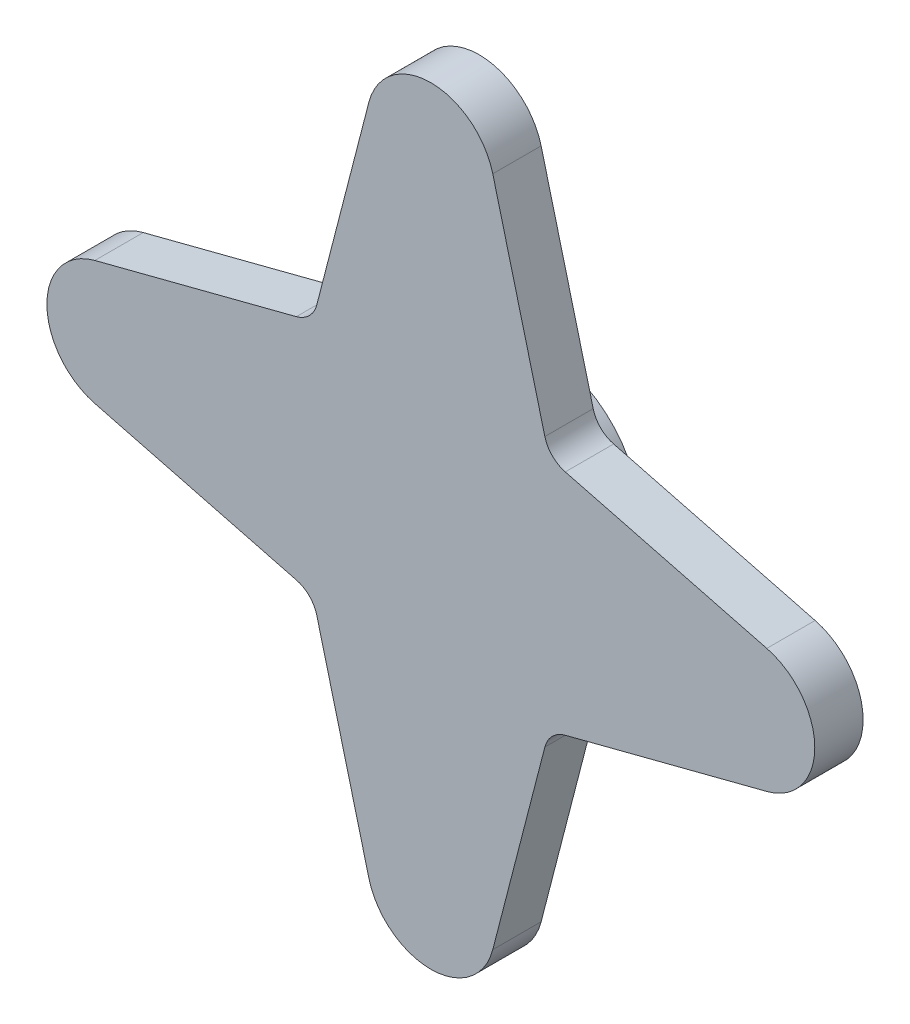
ISO-10303-21;
HEADER;
FILE_DESCRIPTION(('STEP AP214'),'2;1');
FILE_NAME('part.step','',(''),(''),'','','');
FILE_SCHEMA(('AUTOMOTIVE_DESIGN { 1 0 10303 214 1 1 1 1 }'));
ENDSEC;
DATA;
#1=APPLICATION_CONTEXT('core data for automotive mechanical design processes');
#2=APPLICATION_PROTOCOL_DEFINITION('international standard','automotive_design',2000,#1);
#3=PRODUCT_CONTEXT('',#1,'mechanical');
#4=PRODUCT('Part','Part','',(#3));
#5=PRODUCT_RELATED_PRODUCT_CATEGORY('part','',(#4));
#6=PRODUCT_DEFINITION_FORMATION('','',#4);
#7=PRODUCT_DEFINITION_CONTEXT('part definition',#1,'design');
#8=PRODUCT_DEFINITION('design','',#6,#7);
#9=PRODUCT_DEFINITION_SHAPE('','',#8);
#10=(LENGTH_UNIT() NAMED_UNIT(*) SI_UNIT(.MILLI.,.METRE.));
#11=(NAMED_UNIT(*) PLANE_ANGLE_UNIT() SI_UNIT($,.RADIAN.));
#12=(NAMED_UNIT(*) SI_UNIT($,.STERADIAN.) SOLID_ANGLE_UNIT());
#13=UNCERTAINTY_MEASURE_WITH_UNIT(LENGTH_MEASURE(1.E-05),#10,'distance_accuracy_value','');
#14=(GEOMETRIC_REPRESENTATION_CONTEXT(3) GLOBAL_UNCERTAINTY_ASSIGNED_CONTEXT((#13)) GLOBAL_UNIT_ASSIGNED_CONTEXT((#10,
#11,#12)) REPRESENTATION_CONTEXT('',''));
#15=CARTESIAN_POINT('',(0.,0.,0.));
#16=DIRECTION('',(0.,0.,1.));
#17=DIRECTION('',(1.,0.,0.));
#18=AXIS2_PLACEMENT_3D('',#15,#16,#17);
#19=CARTESIAN_POINT('',(-5.15,0.,-2.2));
#20=DIRECTION('',(0.,0.,1.));
#21=DIRECTION('',(1.,0.,0.));
#22=AXIS2_PLACEMENT_3D('',#19,#20,#21);
#23=CYLINDRICAL_SURFACE('',#22,3.45);
#24=CARTESIAN_POINT('',(-5.15,0.,-2.2));
#25=DIRECTION('',(0.,0.,1.));
#26=DIRECTION('',(1.,0.,0.));
#27=AXIS2_PLACEMENT_3D('',#24,#25,#26);
#28=CIRCLE('',#27,3.45);
#29=CARTESIAN_POINT('',(-1.7,0.,-2.2));
#30=VERTEX_POINT('',#29);
#31=EDGE_CURVE('E246',#30,#30,#28,.T.);
#32=ORIENTED_EDGE('',*,*,#31,.T.);
#33=EDGE_LOOP('',(#32));
#34=FACE_BOUND('',#33,.T.);
#35=CARTESIAN_POINT('',(-5.15,0.,0.));
#36=DIRECTION('',(0.,0.,1.));
#37=DIRECTION('',(1.,0.,0.));
#38=AXIS2_PLACEMENT_3D('',#35,#36,#37);
#39=CIRCLE('',#38,3.45);
#40=CARTESIAN_POINT('',(-1.7,0.,0.));
#41=VERTEX_POINT('',#40);
#42=EDGE_CURVE('E224',#41,#41,#39,.T.);
#43=ORIENTED_EDGE('',*,*,#42,.F.);
#44=EDGE_LOOP('',(#43));
#45=FACE_BOUND('',#44,.T.);
#46=ADVANCED_FACE('F37',(#34,#45),#23,.T.);
#47=CARTESIAN_POINT('',(-5.15,0.,-2.2));
#48=DIRECTION('',(0.,0.,1.));
#49=DIRECTION('',(1.,0.,0.));
#50=AXIS2_PLACEMENT_3D('',#47,#48,#49);
#51=CYLINDRICAL_SURFACE('',#50,2.5);
#52=CARTESIAN_POINT('',(-5.15,0.,-0.2));
#53=DIRECTION('',(0.,0.,-1.));
#54=DIRECTION('',(-1.,0.,0.));
#55=AXIS2_PLACEMENT_3D('',#52,#53,#54);
#56=CIRCLE('',#55,2.5);
#57=CARTESIAN_POINT('',(-7.65,0.,-0.2));
#58=VERTEX_POINT('',#57);
#59=EDGE_CURVE('E296',#58,#58,#56,.T.);
#60=ORIENTED_EDGE('',*,*,#59,.F.);
#61=EDGE_LOOP('',(#60));
#62=FACE_BOUND('',#61,.T.);
#63=CARTESIAN_POINT('',(-5.15,0.,-2.2));
#64=DIRECTION('',(0.,0.,1.));
#65=DIRECTION('',(1.,0.,0.));
#66=AXIS2_PLACEMENT_3D('',#63,#64,#65);
#67=CIRCLE('',#66,2.5);
#68=CARTESIAN_POINT('',(-2.65,0.,-2.2));
#69=VERTEX_POINT('',#68);
#70=EDGE_CURVE('E243',#69,#69,#67,.T.);
#71=ORIENTED_EDGE('',*,*,#70,.F.);
#72=EDGE_LOOP('',(#71));
#73=FACE_BOUND('',#72,.T.);
#74=ADVANCED_FACE('F303',(#62,#73),#51,.F.);
#75=CARTESIAN_POINT('',(0.,0.,-2.2));
#76=DIRECTION('',(0.,0.,1.));
#77=DIRECTION('',(1.,0.,0.));
#78=AXIS2_PLACEMENT_3D('',#75,#76,#77);
#79=PLANE('',#78);
#80=ORIENTED_EDGE('',*,*,#70,.T.);
#81=EDGE_LOOP('',(#80));
#82=FACE_BOUND('',#81,.T.);
#83=ORIENTED_EDGE('',*,*,#31,.F.);
#84=EDGE_LOOP('',(#83));
#85=FACE_BOUND('',#84,.T.);
#86=ADVANCED_FACE('F306',(#82,#85),#79,.F.);
#87=CARTESIAN_POINT('',(0.,0.,1.7));
#88=DIRECTION('',(0.,0.,1.));
#89=DIRECTION('',(1.,0.,0.));
#90=AXIS2_PLACEMENT_3D('',#87,#88,#89);
#91=PLANE('',#90);
#92=DIRECTION('',(-0.250229959450548,-0.968186432146917,0.));
#93=VECTOR('',#92,1.);
#94=CARTESIAN_POINT('',(1.00163519950034,3.56009605648765,1.7));
#95=LINE('',#94,#93);
#96=CARTESIAN_POINT('',(-1.14034217000043,-4.72761430269594,1.7));
#97=VERTEX_POINT('',#96);
#98=CARTESIAN_POINT('',(-2.97158052766944,-11.8130174087637,1.7));
#99=VERTEX_POINT('',#98);
#100=EDGE_CURVE('E201',#97,#99,#95,.T.);
#101=ORIENTED_EDGE('',*,*,#100,.F.);
#102=CARTESIAN_POINT('',(-0.172155737853513,-4.97784426214649,1.7));
#103=DIRECTION('',(0.,0.,1.));
#104=DIRECTION('',(1.,0.,0.));
#105=AXIS2_PLACEMENT_3D('',#102,#103,#104);
#106=CIRCLE('',#105,1.);
#107=CARTESIAN_POINT('',(-0.422385697304059,-4.00965782999957,1.7));
#108=VERTEX_POINT('',#107);
#109=EDGE_CURVE('E156',#97,#108,#106,.F.);
#110=ORIENTED_EDGE('',*,*,#109,.T.);
#111=DIRECTION('',(0.968186432146917,0.250229959450548,0.));
#112=VECTOR('',#111,1.);
#113=CARTESIAN_POINT('',(-8.71009605648765,-6.15163519950034,1.7));
#114=LINE('',#113,#112);
#115=CARTESIAN_POINT('',(6.66301740876374,-2.17841947233057,1.7));
#116=VERTEX_POINT('',#115);
#117=EDGE_CURVE('E148',#108,#116,#114,.T.);
#118=ORIENTED_EDGE('',*,*,#117,.T.);
#119=CARTESIAN_POINT('',(6.1,0.,1.7));
#120=DIRECTION('',(0.,0.,1.));
#121=DIRECTION('',(-1.,0.,0.));
#122=AXIS2_PLACEMENT_3D('',#119,#120,#121);
#123=CIRCLE('',#122,2.25);
#124=CARTESIAN_POINT('',(6.66301740876374,2.17841947233056,1.7));
#125=VERTEX_POINT('',#124);
#126=EDGE_CURVE('E153',#116,#125,#123,.T.);
#127=ORIENTED_EDGE('',*,*,#126,.T.);
#128=DIRECTION('',(0.968186432146917,-0.250229959450549,0.));
#129=VECTOR('',#128,1.);
#130=CARTESIAN_POINT('',(-8.71009605648765,6.15163519950035,1.7));
#131=LINE('',#130,#129);
#132=CARTESIAN_POINT('',(-0.422385697304057,4.00965782999957,1.7));
#133=VERTEX_POINT('',#132);
#134=EDGE_CURVE('E170',#133,#125,#131,.T.);
#135=ORIENTED_EDGE('',*,*,#134,.F.);
#136=CARTESIAN_POINT('',(-0.172155737853512,4.97784426214648,1.7));
#137=DIRECTION('',(0.,0.,1.));
#138=DIRECTION('',(1.,0.,0.));
#139=AXIS2_PLACEMENT_3D('',#136,#137,#138);
#140=CIRCLE('',#139,1.);
#141=CARTESIAN_POINT('',(-1.14034217000043,4.72761430269593,1.7));
#142=VERTEX_POINT('',#141);
#143=EDGE_CURVE('E276',#133,#142,#140,.F.);
#144=ORIENTED_EDGE('',*,*,#143,.T.);
#145=DIRECTION('',(-0.250229959450548,0.968186432146917,0.));
#146=VECTOR('',#145,1.);
#147=CARTESIAN_POINT('',(1.00163519950035,-3.56009605648765,1.7));
#148=LINE('',#147,#146);
#149=CARTESIAN_POINT('',(-2.97158052766943,11.8130174087637,1.7));
#150=VERTEX_POINT('',#149);
#151=EDGE_CURVE('E185',#142,#150,#148,.T.);
#152=ORIENTED_EDGE('',*,*,#151,.T.);
#153=CARTESIAN_POINT('',(-5.15,11.25,1.7));
#154=DIRECTION('',(0.,0.,-1.));
#155=DIRECTION('',(0.,-1.,0.));
#156=AXIS2_PLACEMENT_3D('',#153,#154,#155);
#157=CIRCLE('',#156,2.25);
#158=CARTESIAN_POINT('',(-7.32841947233056,11.8130174087637,1.7));
#159=VERTEX_POINT('',#158);
#160=EDGE_CURVE('E188',#159,#150,#157,.T.);
#161=ORIENTED_EDGE('',*,*,#160,.F.);
#162=DIRECTION('',(0.250229959450548,0.968186432146917,0.));
#163=VECTOR('',#162,1.);
#164=CARTESIAN_POINT('',(-11.3016351995003,-3.56009605648765,1.7));
#165=LINE('',#164,#163);
#166=CARTESIAN_POINT('',(-9.15965782999956,4.72761430269594,1.7));
#167=VERTEX_POINT('',#166);
#168=EDGE_CURVE('E183',#167,#159,#165,.T.);
#169=ORIENTED_EDGE('',*,*,#168,.F.);
#170=CARTESIAN_POINT('',(-10.1278442621465,4.97784426214649,1.7));
#171=DIRECTION('',(0.,0.,1.));
#172=DIRECTION('',(1.,0.,0.));
#173=AXIS2_PLACEMENT_3D('',#170,#171,#172);
#174=CIRCLE('',#173,1.);
#175=CARTESIAN_POINT('',(-9.87761430269593,4.00965782999957,1.7));
#176=VERTEX_POINT('',#175);
#177=EDGE_CURVE('E11',#167,#176,#174,.F.);
#178=ORIENTED_EDGE('',*,*,#177,.T.);
#179=DIRECTION('',(-0.968186432146917,-0.250229959450548,0.));
#180=VECTOR('',#179,1.);
#181=CARTESIAN_POINT('',(-1.58990394351235,6.15163519950034,1.7));
#182=LINE('',#181,#180);
#183=CARTESIAN_POINT('',(-16.9630174087637,2.17841947233056,1.7));
#184=VERTEX_POINT('',#183);
#185=EDGE_CURVE('E221',#176,#184,#182,.T.);
#186=ORIENTED_EDGE('',*,*,#185,.T.);
#187=CARTESIAN_POINT('',(-16.4,0.,1.7));
#188=DIRECTION('',(0.,0.,1.));
#189=DIRECTION('',(1.,0.,0.));
#190=AXIS2_PLACEMENT_3D('',#187,#188,#189);
#191=CIRCLE('',#190,2.25);
#192=CARTESIAN_POINT('',(-16.9630174087637,-2.17841947233056,1.7));
#193=VERTEX_POINT('',#192);
#194=EDGE_CURVE('E223',#184,#193,#191,.T.);
#195=ORIENTED_EDGE('',*,*,#194,.T.);
#196=DIRECTION('',(-0.968186432146917,0.250229959450548,0.));
#197=VECTOR('',#196,1.);
#198=CARTESIAN_POINT('',(-1.58990394351235,-6.15163519950035,1.7));
#199=LINE('',#198,#197);
#200=CARTESIAN_POINT('',(-9.87761430269594,-4.00965782999957,1.7));
#201=VERTEX_POINT('',#200);
#202=EDGE_CURVE('E227',#201,#193,#199,.T.);
#203=ORIENTED_EDGE('',*,*,#202,.F.);
#204=CARTESIAN_POINT('',(-10.1278442621465,-4.97784426214648,1.7));
#205=DIRECTION('',(0.,0.,1.));
#206=DIRECTION('',(1.,0.,0.));
#207=AXIS2_PLACEMENT_3D('',#204,#205,#206);
#208=CIRCLE('',#207,1.);
#209=CARTESIAN_POINT('',(-9.15965782999957,-4.72761430269594,1.7));
#210=VERTEX_POINT('',#209);
#211=EDGE_CURVE('E269',#201,#210,#208,.F.);
#212=ORIENTED_EDGE('',*,*,#211,.T.);
#213=DIRECTION('',(0.250229959450548,-0.968186432146917,0.));
#214=VECTOR('',#213,1.);
#215=CARTESIAN_POINT('',(-11.3016351995003,3.56009605648765,1.7));
#216=LINE('',#215,#214);
#217=CARTESIAN_POINT('',(-7.32841947233056,-11.8130174087637,1.7));
#218=VERTEX_POINT('',#217);
#219=EDGE_CURVE('E203',#210,#218,#216,.T.);
#220=ORIENTED_EDGE('',*,*,#219,.T.);
#221=CARTESIAN_POINT('',(-5.15,-11.25,1.7));
#222=DIRECTION('',(0.,0.,-1.));
#223=DIRECTION('',(0.,1.,0.));
#224=AXIS2_PLACEMENT_3D('',#221,#222,#223);
#225=CIRCLE('',#224,2.25);
#226=EDGE_CURVE('E206',#99,#218,#225,.T.);
#227=ORIENTED_EDGE('',*,*,#226,.F.);
#228=EDGE_LOOP('',(#101,#110,#118,#127,#135,#144,#152,#161,#169,#178,#186,#195,#203,#212,#220,#227));
#229=FACE_BOUND('',#228,.T.);
#230=ADVANCED_FACE('F151',(#229),#91,.T.);
#231=CARTESIAN_POINT('',(-1.58990394351235,6.15163519950034,1.7));
#232=DIRECTION('',(0.250229959450548,-0.968186432146917,0.));
#233=DIRECTION('',(0.968186432146917,0.250229959450548,0.));
#234=AXIS2_PLACEMENT_3D('',#231,#232,#233);
#235=PLANE('',#234);
#236=ORIENTED_EDGE('',*,*,#185,.F.);
#237=DIRECTION('',(0.,0.,-1.));
#238=VECTOR('',#237,1.);
#239=CARTESIAN_POINT('',(-9.87761430269593,4.00965782999957,1.7));
#240=LINE('',#239,#238);
#241=CARTESIAN_POINT('',(-9.87761430269593,4.00965782999957,0.));
#242=VERTEX_POINT('',#241);
#243=EDGE_CURVE('E263',#176,#242,#240,.T.);
#244=ORIENTED_EDGE('',*,*,#243,.T.);
#245=DIRECTION('',(-0.968186432146917,-0.250229959450548,0.));
#246=VECTOR('',#245,1.);
#247=CARTESIAN_POINT('',(-1.58990394351235,6.15163519950034,0.));
#248=LINE('',#247,#246);
#249=CARTESIAN_POINT('',(-16.9630174087637,2.17841947233056,0.));
#250=VERTEX_POINT('',#249);
#251=EDGE_CURVE('E220',#242,#250,#248,.T.);
#252=ORIENTED_EDGE('',*,*,#251,.T.);
#253=DIRECTION('',(0.,0.,-1.));
#254=VECTOR('',#253,1.);
#255=CARTESIAN_POINT('',(-16.9630174087637,2.17841947233056,1.7));
#256=LINE('',#255,#254);
#257=EDGE_CURVE('E240',#184,#250,#256,.T.);
#258=ORIENTED_EDGE('',*,*,#257,.F.);
#259=EDGE_LOOP('',(#236,#244,#252,#258));
#260=FACE_BOUND('',#259,.T.);
#261=ADVANCED_FACE('F338',(#260),#235,.F.);
#262=CARTESIAN_POINT('',(-16.4,0.,1.7));
#263=DIRECTION('',(0.,0.,-1.));
#264=DIRECTION('',(-1.,0.,0.));
#265=AXIS2_PLACEMENT_3D('',#262,#263,#264);
#266=CYLINDRICAL_SURFACE('',#265,2.25);
#267=CARTESIAN_POINT('',(-16.4,0.,0.));
#268=DIRECTION('',(0.,0.,1.));
#269=DIRECTION('',(1.,0.,0.));
#270=AXIS2_PLACEMENT_3D('',#267,#268,#269);
#271=CIRCLE('',#270,2.25);
#272=CARTESIAN_POINT('',(-16.9630174087637,-2.17841947233056,0.));
#273=VERTEX_POINT('',#272);
#274=EDGE_CURVE('E231',#250,#273,#271,.T.);
#275=ORIENTED_EDGE('',*,*,#274,.T.);
#276=DIRECTION('',(0.,0.,-1.));
#277=VECTOR('',#276,1.);
#278=CARTESIAN_POINT('',(-16.9630174087637,-2.17841947233056,1.7));
#279=LINE('',#278,#277);
#280=EDGE_CURVE('E229',#193,#273,#279,.T.);
#281=ORIENTED_EDGE('',*,*,#280,.F.);
#282=ORIENTED_EDGE('',*,*,#194,.F.);
#283=ORIENTED_EDGE('',*,*,#257,.T.);
#284=EDGE_LOOP('',(#275,#281,#282,#283));
#285=FACE_BOUND('',#284,.T.);
#286=ADVANCED_FACE('F331',(#285),#266,.T.);
#287=CARTESIAN_POINT('',(-1.58990394351235,-6.15163519950035,1.7));
#288=DIRECTION('',(-0.250229959450548,-0.968186432146917,0.));
#289=DIRECTION('',(0.968186432146917,-0.250229959450548,0.));
#290=AXIS2_PLACEMENT_3D('',#287,#288,#289);
#291=PLANE('',#290);
#292=DIRECTION('',(-0.968186432146917,0.250229959450548,0.));
#293=VECTOR('',#292,1.);
#294=CARTESIAN_POINT('',(-1.58990394351235,-6.15163519950035,0.));
#295=LINE('',#294,#293);
#296=CARTESIAN_POINT('',(-9.87761430269594,-4.00965782999957,0.));
#297=VERTEX_POINT('',#296);
#298=EDGE_CURVE('E234',#297,#273,#295,.T.);
#299=ORIENTED_EDGE('',*,*,#298,.F.);
#300=DIRECTION('',(0.,0.,-1.));
#301=VECTOR('',#300,1.);
#302=CARTESIAN_POINT('',(-9.87761430269594,-4.00965782999957,1.7));
#303=LINE('',#302,#301);
#304=EDGE_CURVE('E252',#297,#201,#303,.F.);
#305=ORIENTED_EDGE('',*,*,#304,.T.);
#306=ORIENTED_EDGE('',*,*,#202,.T.);
#307=ORIENTED_EDGE('',*,*,#280,.T.);
#308=EDGE_LOOP('',(#299,#305,#306,#307));
#309=FACE_BOUND('',#308,.T.);
#310=ADVANCED_FACE('F322',(#309),#291,.T.);
#311=CARTESIAN_POINT('',(0.,0.,0.));
#312=DIRECTION('',(0.,0.,1.));
#313=DIRECTION('',(1.,0.,0.));
#314=AXIS2_PLACEMENT_3D('',#311,#312,#313);
#315=PLANE('',#314);
#316=ORIENTED_EDGE('',*,*,#42,.T.);
#317=EDGE_LOOP('',(#316));
#318=FACE_BOUND('',#317,.T.);
#319=ORIENTED_EDGE('',*,*,#251,.F.);
#320=CARTESIAN_POINT('',(-10.1278442621465,4.97784426214649,0.));
#321=DIRECTION('',(0.,0.,1.));
#322=DIRECTION('',(1.,0.,0.));
#323=AXIS2_PLACEMENT_3D('',#320,#321,#322);
#324=CIRCLE('',#323,1.);
#325=CARTESIAN_POINT('',(-9.15965782999956,4.72761430269594,0.));
#326=VERTEX_POINT('',#325);
#327=EDGE_CURVE('E45',#242,#326,#324,.T.);
#328=ORIENTED_EDGE('',*,*,#327,.T.);
#329=DIRECTION('',(0.250229959450548,0.968186432146917,0.));
#330=VECTOR('',#329,1.);
#331=CARTESIAN_POINT('',(-11.3016351995003,-3.56009605648765,0.));
#332=LINE('',#331,#330);
#333=CARTESIAN_POINT('',(-7.32841947233056,11.8130174087637,0.));
#334=VERTEX_POINT('',#333);
#335=EDGE_CURVE('E176',#326,#334,#332,.T.);
#336=ORIENTED_EDGE('',*,*,#335,.T.);
#337=CARTESIAN_POINT('',(-5.15,11.25,0.));
#338=DIRECTION('',(0.,0.,-1.));
#339=DIRECTION('',(0.,-1.,0.));
#340=AXIS2_PLACEMENT_3D('',#337,#338,#339);
#341=CIRCLE('',#340,2.25);
#342=CARTESIAN_POINT('',(-2.97158052766943,11.8130174087637,0.));
#343=VERTEX_POINT('',#342);
#344=EDGE_CURVE('E186',#334,#343,#341,.T.);
#345=ORIENTED_EDGE('',*,*,#344,.T.);
#346=DIRECTION('',(-0.250229959450548,0.968186432146917,0.));
#347=VECTOR('',#346,1.);
#348=CARTESIAN_POINT('',(1.00163519950035,-3.56009605648765,0.));
#349=LINE('',#348,#347);
#350=CARTESIAN_POINT('',(-1.14034217000043,4.72761430269593,0.));
#351=VERTEX_POINT('',#350);
#352=EDGE_CURVE('E178',#351,#343,#349,.T.);
#353=ORIENTED_EDGE('',*,*,#352,.F.);
#354=CARTESIAN_POINT('',(-0.172155737853512,4.97784426214648,0.));
#355=DIRECTION('',(0.,0.,1.));
#356=DIRECTION('',(1.,0.,0.));
#357=AXIS2_PLACEMENT_3D('',#354,#355,#356);
#358=CIRCLE('',#357,1.);
#359=CARTESIAN_POINT('',(-0.422385697304057,4.00965782999957,0.));
#360=VERTEX_POINT('',#359);
#361=EDGE_CURVE('E274',#351,#360,#358,.T.);
#362=ORIENTED_EDGE('',*,*,#361,.T.);
#363=DIRECTION('',(0.968186432146917,-0.250229959450549,0.));
#364=VECTOR('',#363,1.);
#365=CARTESIAN_POINT('',(-8.71009605648765,6.15163519950035,0.));
#366=LINE('',#365,#364);
#367=CARTESIAN_POINT('',(6.66301740876374,2.17841947233056,0.));
#368=VERTEX_POINT('',#367);
#369=EDGE_CURVE('E161',#360,#368,#366,.T.);
#370=ORIENTED_EDGE('',*,*,#369,.T.);
#371=CARTESIAN_POINT('',(6.1,0.,0.));
#372=DIRECTION('',(0.,0.,1.));
#373=DIRECTION('',(-1.,0.,0.));
#374=AXIS2_PLACEMENT_3D('',#371,#372,#373);
#375=CIRCLE('',#374,2.25);
#376=CARTESIAN_POINT('',(6.66301740876374,-2.17841947233057,0.));
#377=VERTEX_POINT('',#376);
#378=EDGE_CURVE('E292',#377,#368,#375,.T.);
#379=ORIENTED_EDGE('',*,*,#378,.F.);
#380=DIRECTION('',(0.968186432146917,0.250229959450548,0.));
#381=VECTOR('',#380,1.);
#382=CARTESIAN_POINT('',(-8.71009605648765,-6.15163519950034,0.));
#383=LINE('',#382,#381);
#384=CARTESIAN_POINT('',(-0.422385697304059,-4.00965782999957,0.));
#385=VERTEX_POINT('',#384);
#386=EDGE_CURVE('E174',#385,#377,#383,.T.);
#387=ORIENTED_EDGE('',*,*,#386,.F.);
#388=CARTESIAN_POINT('',(-0.172155737853513,-4.97784426214649,0.));
#389=DIRECTION('',(0.,0.,1.));
#390=DIRECTION('',(1.,0.,0.));
#391=AXIS2_PLACEMENT_3D('',#388,#389,#390);
#392=CIRCLE('',#391,1.);
#393=CARTESIAN_POINT('',(-1.14034217000043,-4.72761430269594,0.));
#394=VERTEX_POINT('',#393);
#395=EDGE_CURVE('E271',#385,#394,#392,.T.);
#396=ORIENTED_EDGE('',*,*,#395,.T.);
#397=DIRECTION('',(-0.250229959450548,-0.968186432146917,0.));
#398=VECTOR('',#397,1.);
#399=CARTESIAN_POINT('',(1.00163519950034,3.56009605648765,0.));
#400=LINE('',#399,#398);
#401=CARTESIAN_POINT('',(-2.97158052766944,-11.8130174087637,0.));
#402=VERTEX_POINT('',#401);
#403=EDGE_CURVE('E200',#394,#402,#400,.T.);
#404=ORIENTED_EDGE('',*,*,#403,.T.);
#405=CARTESIAN_POINT('',(-5.15,-11.25,0.));
#406=DIRECTION('',(0.,0.,-1.));
#407=DIRECTION('',(0.,1.,0.));
#408=AXIS2_PLACEMENT_3D('',#405,#406,#407);
#409=CIRCLE('',#408,2.25);
#410=CARTESIAN_POINT('',(-7.32841947233056,-11.8130174087637,0.));
#411=VERTEX_POINT('',#410);
#412=EDGE_CURVE('E204',#402,#411,#409,.T.);
#413=ORIENTED_EDGE('',*,*,#412,.T.);
#414=DIRECTION('',(0.250229959450548,-0.968186432146917,0.));
#415=VECTOR('',#414,1.);
#416=CARTESIAN_POINT('',(-11.3016351995003,3.56009605648765,0.));
#417=LINE('',#416,#415);
#418=CARTESIAN_POINT('',(-9.15965782999957,-4.72761430269594,0.));
#419=VERTEX_POINT('',#418);
#420=EDGE_CURVE('E211',#419,#411,#417,.T.);
#421=ORIENTED_EDGE('',*,*,#420,.F.);
#422=CARTESIAN_POINT('',(-10.1278442621465,-4.97784426214648,0.));
#423=DIRECTION('',(0.,0.,1.));
#424=DIRECTION('',(1.,0.,0.));
#425=AXIS2_PLACEMENT_3D('',#422,#423,#424);
#426=CIRCLE('',#425,1.);
#427=EDGE_CURVE('E267',#419,#297,#426,.T.);
#428=ORIENTED_EDGE('',*,*,#427,.T.);
#429=ORIENTED_EDGE('',*,*,#298,.T.);
#430=ORIENTED_EDGE('',*,*,#274,.F.);
#431=EDGE_LOOP('',(#319,#328,#336,#345,#353,#362,#370,#379,#387,#396,#404,#413,#421,#428,#429,#430));
#432=FACE_BOUND('',#431,.T.);
#433=ADVANCED_FACE('F289',(#318,#432),#315,.F.);
#434=CARTESIAN_POINT('',(1.00163519950034,3.56009605648765,1.7));
#435=DIRECTION('',(0.968186432146917,-0.250229959450548,0.));
#436=DIRECTION('',(0.250229959450548,0.968186432146917,0.));
#437=AXIS2_PLACEMENT_3D('',#434,#435,#436);
#438=PLANE('',#437);
#439=ORIENTED_EDGE('',*,*,#403,.F.);
#440=DIRECTION('',(0.,0.,-1.));
#441=VECTOR('',#440,1.);
#442=CARTESIAN_POINT('',(-1.14034217000043,-4.72761430269594,1.7));
#443=LINE('',#442,#441);
#444=EDGE_CURVE('E256',#394,#97,#443,.F.);
#445=ORIENTED_EDGE('',*,*,#444,.T.);
#446=ORIENTED_EDGE('',*,*,#100,.T.);
#447=DIRECTION('',(0.,0.,-1.));
#448=VECTOR('',#447,1.);
#449=CARTESIAN_POINT('',(-2.97158052766944,-11.8130174087637,1.7));
#450=LINE('',#449,#448);
#451=EDGE_CURVE('E209',#99,#402,#450,.T.);
#452=ORIENTED_EDGE('',*,*,#451,.T.);
#453=EDGE_LOOP('',(#439,#445,#446,#452));
#454=FACE_BOUND('',#453,.T.);
#455=ADVANCED_FACE('F321',(#454),#438,.T.);
#456=CARTESIAN_POINT('',(-11.3016351995003,3.56009605648765,1.7));
#457=DIRECTION('',(0.968186432146917,0.250229959450548,0.));
#458=DIRECTION('',(-0.250229959450548,0.968186432146917,0.));
#459=AXIS2_PLACEMENT_3D('',#456,#457,#458);
#460=PLANE('',#459);
#461=ORIENTED_EDGE('',*,*,#219,.F.);
#462=DIRECTION('',(0.,0.,-1.));
#463=VECTOR('',#462,1.);
#464=CARTESIAN_POINT('',(-9.15965782999957,-4.72761430269594,1.7));
#465=LINE('',#464,#463);
#466=EDGE_CURVE('E249',#210,#419,#465,.T.);
#467=ORIENTED_EDGE('',*,*,#466,.T.);
#468=ORIENTED_EDGE('',*,*,#420,.T.);
#469=DIRECTION('',(0.,0.,-1.));
#470=VECTOR('',#469,1.);
#471=CARTESIAN_POINT('',(-7.32841947233056,-11.8130174087637,1.7));
#472=LINE('',#471,#470);
#473=EDGE_CURVE('E217',#218,#411,#472,.T.);
#474=ORIENTED_EDGE('',*,*,#473,.F.);
#475=EDGE_LOOP('',(#461,#467,#468,#474));
#476=FACE_BOUND('',#475,.T.);
#477=ADVANCED_FACE('F328',(#476),#460,.F.);
#478=CARTESIAN_POINT('',(-5.15,-11.25,1.7));
#479=DIRECTION('',(0.,0.,-1.));
#480=DIRECTION('',(-1.,0.,0.));
#481=AXIS2_PLACEMENT_3D('',#478,#479,#480);
#482=CYLINDRICAL_SURFACE('',#481,2.25);
#483=ORIENTED_EDGE('',*,*,#412,.F.);
#484=ORIENTED_EDGE('',*,*,#451,.F.);
#485=ORIENTED_EDGE('',*,*,#226,.T.);
#486=ORIENTED_EDGE('',*,*,#473,.T.);
#487=EDGE_LOOP('',(#483,#484,#485,#486));
#488=FACE_BOUND('',#487,.T.);
#489=ADVANCED_FACE('F381',(#488),#482,.T.);
#490=CARTESIAN_POINT('',(-11.3016351995003,-3.56009605648765,1.7));
#491=DIRECTION('',(-0.968186432146917,0.250229959450548,0.));
#492=DIRECTION('',(-0.250229959450549,-0.968186432146917,0.));
#493=AXIS2_PLACEMENT_3D('',#490,#491,#492);
#494=PLANE('',#493);
#495=ORIENTED_EDGE('',*,*,#335,.F.);
#496=DIRECTION('',(0.,0.,-1.));
#497=VECTOR('',#496,1.);
#498=CARTESIAN_POINT('',(-9.15965782999956,4.72761430269594,1.7));
#499=LINE('',#498,#497);
#500=EDGE_CURVE('E52',#326,#167,#499,.F.);
#501=ORIENTED_EDGE('',*,*,#500,.T.);
#502=ORIENTED_EDGE('',*,*,#168,.T.);
#503=DIRECTION('',(0.,0.,-1.));
#504=VECTOR('',#503,1.);
#505=CARTESIAN_POINT('',(-7.32841947233056,11.8130174087637,1.7));
#506=LINE('',#505,#504);
#507=EDGE_CURVE('E190',#159,#334,#506,.T.);
#508=ORIENTED_EDGE('',*,*,#507,.T.);
#509=EDGE_LOOP('',(#495,#501,#502,#508));
#510=FACE_BOUND('',#509,.T.);
#511=ADVANCED_FACE('F385',(#510),#494,.T.);
#512=CARTESIAN_POINT('',(1.00163519950035,-3.56009605648765,1.7));
#513=DIRECTION('',(-0.968186432146917,-0.250229959450548,0.));
#514=DIRECTION('',(0.250229959450548,-0.968186432146917,0.));
#515=AXIS2_PLACEMENT_3D('',#512,#513,#514);
#516=PLANE('',#515);
#517=ORIENTED_EDGE('',*,*,#151,.F.);
#518=DIRECTION('',(0.,0.,-1.));
#519=VECTOR('',#518,1.);
#520=CARTESIAN_POINT('',(-1.14034217000043,4.72761430269593,1.7));
#521=LINE('',#520,#519);
#522=EDGE_CURVE('E258',#142,#351,#521,.T.);
#523=ORIENTED_EDGE('',*,*,#522,.T.);
#524=ORIENTED_EDGE('',*,*,#352,.T.);
#525=DIRECTION('',(0.,0.,-1.));
#526=VECTOR('',#525,1.);
#527=CARTESIAN_POINT('',(-2.97158052766943,11.8130174087637,1.7));
#528=LINE('',#527,#526);
#529=EDGE_CURVE('E197',#150,#343,#528,.T.);
#530=ORIENTED_EDGE('',*,*,#529,.F.);
#531=EDGE_LOOP('',(#517,#523,#524,#530));
#532=FACE_BOUND('',#531,.T.);
#533=ADVANCED_FACE('F285',(#532),#516,.F.);
#534=CARTESIAN_POINT('',(-5.15,11.25,1.7));
#535=DIRECTION('',(0.,0.,-1.));
#536=DIRECTION('',(-1.,0.,0.));
#537=AXIS2_PLACEMENT_3D('',#534,#535,#536);
#538=CYLINDRICAL_SURFACE('',#537,2.25);
#539=ORIENTED_EDGE('',*,*,#344,.F.);
#540=ORIENTED_EDGE('',*,*,#507,.F.);
#541=ORIENTED_EDGE('',*,*,#160,.T.);
#542=ORIENTED_EDGE('',*,*,#529,.T.);
#543=EDGE_LOOP('',(#539,#540,#541,#542));
#544=FACE_BOUND('',#543,.T.);
#545=ADVANCED_FACE('F395',(#544),#538,.T.);
#546=CARTESIAN_POINT('',(-8.71009605648765,-6.15163519950034,1.7));
#547=DIRECTION('',(-0.250229959450548,0.968186432146917,0.));
#548=DIRECTION('',(-0.968186432146917,-0.250229959450548,0.));
#549=AXIS2_PLACEMENT_3D('',#546,#547,#548);
#550=PLANE('',#549);
#551=ORIENTED_EDGE('',*,*,#117,.F.);
#552=DIRECTION('',(0.,0.,-1.));
#553=VECTOR('',#552,1.);
#554=CARTESIAN_POINT('',(-0.422385697304061,-4.00965782999957,1.7));
#555=LINE('',#554,#553);
#556=EDGE_CURVE('E254',#108,#385,#555,.T.);
#557=ORIENTED_EDGE('',*,*,#556,.T.);
#558=ORIENTED_EDGE('',*,*,#386,.T.);
#559=DIRECTION('',(0.,0.,-1.));
#560=VECTOR('',#559,1.);
#561=CARTESIAN_POINT('',(6.66301740876374,-2.17841947233057,1.7));
#562=LINE('',#561,#560);
#563=EDGE_CURVE('E167',#116,#377,#562,.T.);
#564=ORIENTED_EDGE('',*,*,#563,.F.);
#565=EDGE_LOOP('',(#551,#557,#558,#564));
#566=FACE_BOUND('',#565,.T.);
#567=ADVANCED_FACE('F172',(#566),#550,.F.);
#568=CARTESIAN_POINT('',(6.1,0.,1.7));
#569=DIRECTION('',(0.,0.,-1.));
#570=DIRECTION('',(-1.,0.,0.));
#571=AXIS2_PLACEMENT_3D('',#568,#569,#570);
#572=CYLINDRICAL_SURFACE('',#571,2.25);
#573=ORIENTED_EDGE('',*,*,#378,.T.);
#574=DIRECTION('',(0.,0.,-1.));
#575=VECTOR('',#574,1.);
#576=CARTESIAN_POINT('',(6.66301740876374,2.17841947233056,1.7));
#577=LINE('',#576,#575);
#578=EDGE_CURVE('E169',#125,#368,#577,.T.);
#579=ORIENTED_EDGE('',*,*,#578,.F.);
#580=ORIENTED_EDGE('',*,*,#126,.F.);
#581=ORIENTED_EDGE('',*,*,#563,.T.);
#582=EDGE_LOOP('',(#573,#579,#580,#581));
#583=FACE_BOUND('',#582,.T.);
#584=ADVANCED_FACE('F166',(#583),#572,.T.);
#585=CARTESIAN_POINT('',(-8.71009605648765,6.15163519950035,1.7));
#586=DIRECTION('',(0.250229959450549,0.968186432146917,0.));
#587=DIRECTION('',(-0.968186432146917,0.250229959450549,0.));
#588=AXIS2_PLACEMENT_3D('',#585,#586,#587);
#589=PLANE('',#588);
#590=ORIENTED_EDGE('',*,*,#369,.F.);
#591=DIRECTION('',(0.,0.,-1.));
#592=VECTOR('',#591,1.);
#593=CARTESIAN_POINT('',(-0.422385697304061,4.00965782999957,1.7));
#594=LINE('',#593,#592);
#595=EDGE_CURVE('E261',#360,#133,#594,.F.);
#596=ORIENTED_EDGE('',*,*,#595,.T.);
#597=ORIENTED_EDGE('',*,*,#134,.T.);
#598=ORIENTED_EDGE('',*,*,#578,.T.);
#599=EDGE_LOOP('',(#590,#596,#597,#598));
#600=FACE_BOUND('',#599,.T.);
#601=ADVANCED_FACE('F291',(#600),#589,.T.);
#602=CARTESIAN_POINT('',(-10.1278442621465,-4.97784426214648,1.7));
#603=DIRECTION('',(0.,0.,-1.));
#604=DIRECTION('',(-1.,0.,0.));
#605=AXIS2_PLACEMENT_3D('',#602,#603,#604);
#606=CYLINDRICAL_SURFACE('',#605,1.);
#607=ORIENTED_EDGE('',*,*,#211,.F.);
#608=ORIENTED_EDGE('',*,*,#304,.F.);
#609=ORIENTED_EDGE('',*,*,#427,.F.);
#610=ORIENTED_EDGE('',*,*,#466,.F.);
#611=EDGE_LOOP('',(#607,#608,#609,#610));
#612=FACE_BOUND('',#611,.T.);
#613=ADVANCED_FACE('F345',(#612),#606,.F.);
#614=CARTESIAN_POINT('',(-0.172155737853513,-4.97784426214649,1.7));
#615=DIRECTION('',(0.,0.,-1.));
#616=DIRECTION('',(-1.,0.,0.));
#617=AXIS2_PLACEMENT_3D('',#614,#615,#616);
#618=CYLINDRICAL_SURFACE('',#617,1.);
#619=ORIENTED_EDGE('',*,*,#109,.F.);
#620=ORIENTED_EDGE('',*,*,#444,.F.);
#621=ORIENTED_EDGE('',*,*,#395,.F.);
#622=ORIENTED_EDGE('',*,*,#556,.F.);
#623=EDGE_LOOP('',(#619,#620,#621,#622));
#624=FACE_BOUND('',#623,.T.);
#625=ADVANCED_FACE('F348',(#624),#618,.F.);
#626=CARTESIAN_POINT('',(-0.172155737853512,4.97784426214648,1.7));
#627=DIRECTION('',(0.,0.,-1.));
#628=DIRECTION('',(-1.,0.,0.));
#629=AXIS2_PLACEMENT_3D('',#626,#627,#628);
#630=CYLINDRICAL_SURFACE('',#629,1.);
#631=ORIENTED_EDGE('',*,*,#143,.F.);
#632=ORIENTED_EDGE('',*,*,#595,.F.);
#633=ORIENTED_EDGE('',*,*,#361,.F.);
#634=ORIENTED_EDGE('',*,*,#522,.F.);
#635=EDGE_LOOP('',(#631,#632,#633,#634));
#636=FACE_BOUND('',#635,.T.);
#637=ADVANCED_FACE('F287',(#636),#630,.F.);
#638=CARTESIAN_POINT('',(-10.1278442621465,4.97784426214649,1.7));
#639=DIRECTION('',(0.,0.,-1.));
#640=DIRECTION('',(-1.,0.,0.));
#641=AXIS2_PLACEMENT_3D('',#638,#639,#640);
#642=CYLINDRICAL_SURFACE('',#641,1.);
#643=ORIENTED_EDGE('',*,*,#177,.F.);
#644=ORIENTED_EDGE('',*,*,#500,.F.);
#645=ORIENTED_EDGE('',*,*,#327,.F.);
#646=ORIENTED_EDGE('',*,*,#243,.F.);
#647=EDGE_LOOP('',(#643,#644,#645,#646));
#648=FACE_BOUND('',#647,.T.);
#649=ADVANCED_FACE('F39',(#648),#642,.F.);
#650=CARTESIAN_POINT('',(-5.15,0.,-0.2));
#651=DIRECTION('',(0.,0.,-1.));
#652=DIRECTION('',(-1.,0.,0.));
#653=AXIS2_PLACEMENT_3D('',#650,#651,#652);
#654=PLANE('',#653);
#655=ORIENTED_EDGE('',*,*,#59,.T.);
#656=EDGE_LOOP('',(#655));
#657=FACE_BOUND('',#656,.T.);
#658=ADVANCED_FACE('F301',(#657),#654,.T.);
#659=CLOSED_SHELL('',(#46,#74,#86,#230,#261,#286,#310,#433,#455,#477,#489,#511,#533,#545,#567,
#584,#601,#613,#625,#637,#649,#658));
#660=MANIFOLD_SOLID_BREP('B2',#659);
#661=ADVANCED_BREP_SHAPE_REPRESENTATION('',(#18,#660),#14);
#662=SHAPE_DEFINITION_REPRESENTATION(#9,#661);
ENDSEC;
END-ISO-10303-21;
